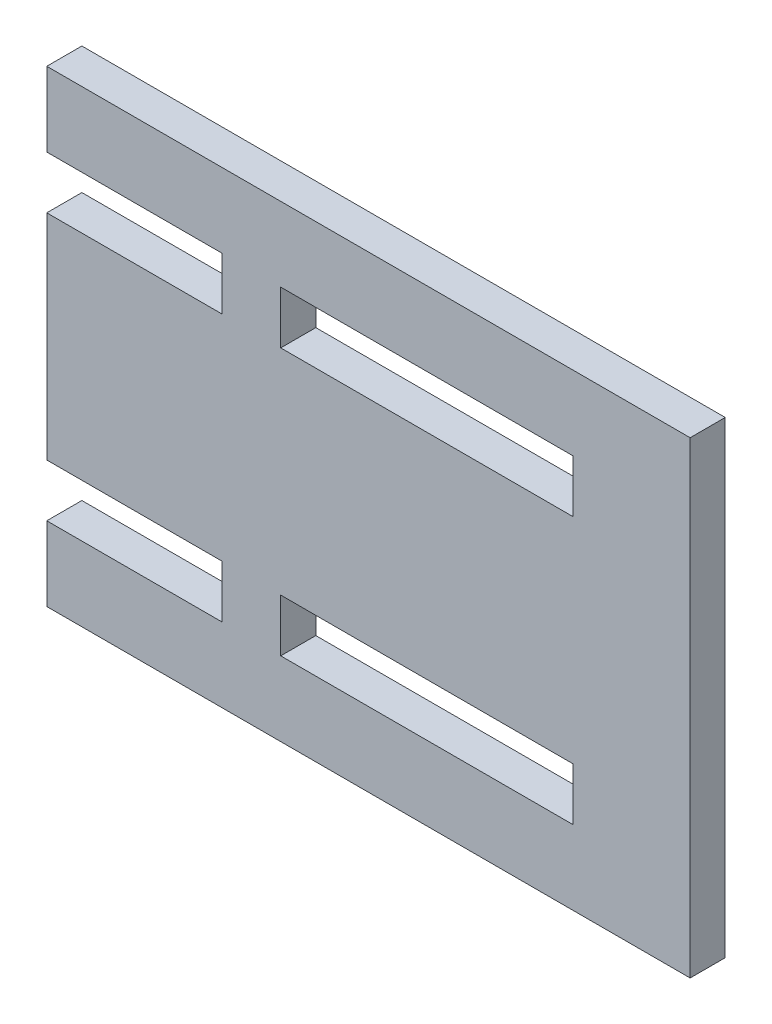
ISO-10303-21;
HEADER;
FILE_DESCRIPTION(('STEP AP214'),'2;1');
FILE_NAME('part.step','',(''),(''),'','','');
FILE_SCHEMA(('AUTOMOTIVE_DESIGN { 1 0 10303 214 1 1 1 1 }'));
ENDSEC;
DATA;
#1=APPLICATION_CONTEXT('core data for automotive mechanical design processes');
#2=APPLICATION_PROTOCOL_DEFINITION('international standard','automotive_design',2000,#1);
#3=PRODUCT_CONTEXT('',#1,'mechanical');
#4=PRODUCT('Part','Part','',(#3));
#5=PRODUCT_RELATED_PRODUCT_CATEGORY('part','',(#4));
#6=PRODUCT_DEFINITION_FORMATION('','',#4);
#7=PRODUCT_DEFINITION_CONTEXT('part definition',#1,'design');
#8=PRODUCT_DEFINITION('design','',#6,#7);
#9=PRODUCT_DEFINITION_SHAPE('','',#8);
#10=(LENGTH_UNIT() NAMED_UNIT(*) SI_UNIT(.MILLI.,.METRE.));
#11=(NAMED_UNIT(*) PLANE_ANGLE_UNIT() SI_UNIT($,.RADIAN.));
#12=(NAMED_UNIT(*) SI_UNIT($,.STERADIAN.) SOLID_ANGLE_UNIT());
#13=UNCERTAINTY_MEASURE_WITH_UNIT(LENGTH_MEASURE(1.E-05),#10,'distance_accuracy_value','');
#14=(GEOMETRIC_REPRESENTATION_CONTEXT(3) GLOBAL_UNCERTAINTY_ASSIGNED_CONTEXT((#13)) GLOBAL_UNIT_ASSIGNED_CONTEXT((#10,
#11,#12)) REPRESENTATION_CONTEXT('',''));
#15=CARTESIAN_POINT('',(0.,0.,0.));
#16=DIRECTION('',(0.,0.,1.));
#17=DIRECTION('',(1.,0.,0.));
#18=AXIS2_PLACEMENT_3D('',#15,#16,#17);
#19=CARTESIAN_POINT('',(-13.65,0.,-3.));
#20=DIRECTION('',(-1.,0.,0.));
#21=DIRECTION('',(0.,0.,1.));
#22=AXIS2_PLACEMENT_3D('',#19,#20,#21);
#23=PLANE('',#22);
#24=DIRECTION('',(0.,-1.,0.));
#25=VECTOR('',#24,1.);
#26=CARTESIAN_POINT('',(-13.65,0.,0.));
#27=LINE('',#26,#25);
#28=CARTESIAN_POINT('',(-13.65,0.,0.));
#29=VERTEX_POINT('',#28);
#30=CARTESIAN_POINT('',(-13.65,-4.5,0.));
#31=VERTEX_POINT('',#30);
#32=EDGE_CURVE('E251',#29,#31,#27,.T.);
#33=ORIENTED_EDGE('',*,*,#32,.T.);
#34=DIRECTION('',(0.,0.,1.));
#35=VECTOR('',#34,1.);
#36=CARTESIAN_POINT('',(-13.65,-4.5,-3.));
#37=LINE('',#36,#35);
#38=CARTESIAN_POINT('',(-13.65,-4.5,-3.));
#39=VERTEX_POINT('',#38);
#40=EDGE_CURVE('E11',#39,#31,#37,.T.);
#41=ORIENTED_EDGE('',*,*,#40,.F.);
#42=DIRECTION('',(0.,-1.,0.));
#43=VECTOR('',#42,1.);
#44=CARTESIAN_POINT('',(-13.65,0.,-3.));
#45=LINE('',#44,#43);
#46=CARTESIAN_POINT('',(-13.65,0.,-3.));
#47=VERTEX_POINT('',#46);
#48=EDGE_CURVE('E60',#47,#39,#45,.T.);
#49=ORIENTED_EDGE('',*,*,#48,.F.);
#50=DIRECTION('',(0.,0.,1.));
#51=VECTOR('',#50,1.);
#52=CARTESIAN_POINT('',(-13.65,0.,-3.));
#53=LINE('',#52,#51);
#54=EDGE_CURVE('E198',#47,#29,#53,.T.);
#55=ORIENTED_EDGE('',*,*,#54,.T.);
#56=EDGE_LOOP('',(#33,#41,#49,#55));
#57=FACE_BOUND('',#56,.T.);
#58=ADVANCED_FACE('F41',(#57),#23,.F.);
#59=CARTESIAN_POINT('',(0.,-4.5,-3.));
#60=DIRECTION('',(0.,1.,0.));
#61=DIRECTION('',(0.,0.,1.));
#62=AXIS2_PLACEMENT_3D('',#59,#60,#61);
#63=PLANE('',#62);
#64=DIRECTION('',(-1.,0.,0.));
#65=VECTOR('',#64,1.);
#66=CARTESIAN_POINT('',(0.,-4.5,0.));
#67=LINE('',#66,#65);
#68=CARTESIAN_POINT('',(11.35,-4.5,0.));
#69=VERTEX_POINT('',#68);
#70=EDGE_CURVE('E256',#69,#31,#67,.T.);
#71=ORIENTED_EDGE('',*,*,#70,.F.);
#72=DIRECTION('',(0.,0.,1.));
#73=VECTOR('',#72,1.);
#74=CARTESIAN_POINT('',(11.35,-4.5,-3.));
#75=LINE('',#74,#73);
#76=CARTESIAN_POINT('',(11.35,-4.5,-3.));
#77=VERTEX_POINT('',#76);
#78=EDGE_CURVE('E51',#77,#69,#75,.T.);
#79=ORIENTED_EDGE('',*,*,#78,.F.);
#80=DIRECTION('',(-1.,0.,0.));
#81=VECTOR('',#80,1.);
#82=CARTESIAN_POINT('',(0.,-4.5,-3.));
#83=LINE('',#82,#81);
#84=EDGE_CURVE('E190',#77,#39,#83,.T.);
#85=ORIENTED_EDGE('',*,*,#84,.T.);
#86=ORIENTED_EDGE('',*,*,#40,.T.);
#87=EDGE_LOOP('',(#71,#79,#85,#86));
#88=FACE_BOUND('',#87,.T.);
#89=ADVANCED_FACE('F315',(#88),#63,.T.);
#90=CARTESIAN_POINT('',(11.35,0.,-3.));
#91=DIRECTION('',(1.,0.,0.));
#92=DIRECTION('',(0.,0.,-1.));
#93=AXIS2_PLACEMENT_3D('',#90,#91,#92);
#94=PLANE('',#93);
#95=DIRECTION('',(0.,1.,0.));
#96=VECTOR('',#95,1.);
#97=CARTESIAN_POINT('',(11.35,0.,0.));
#98=LINE('',#97,#96);
#99=CARTESIAN_POINT('',(11.35,0.,0.));
#100=VERTEX_POINT('',#99);
#101=EDGE_CURVE('E195',#69,#100,#98,.T.);
#102=ORIENTED_EDGE('',*,*,#101,.T.);
#103=DIRECTION('',(0.,0.,1.));
#104=VECTOR('',#103,1.);
#105=CARTESIAN_POINT('',(11.35,0.,-3.));
#106=LINE('',#105,#104);
#107=CARTESIAN_POINT('',(11.35,0.,-3.));
#108=VERTEX_POINT('',#107);
#109=EDGE_CURVE('E193',#108,#100,#106,.T.);
#110=ORIENTED_EDGE('',*,*,#109,.F.);
#111=DIRECTION('',(0.,1.,0.));
#112=VECTOR('',#111,1.);
#113=CARTESIAN_POINT('',(11.35,0.,-3.));
#114=LINE('',#113,#112);
#115=EDGE_CURVE('E184',#77,#108,#114,.T.);
#116=ORIENTED_EDGE('',*,*,#115,.F.);
#117=ORIENTED_EDGE('',*,*,#78,.T.);
#118=EDGE_LOOP('',(#102,#110,#116,#117));
#119=FACE_BOUND('',#118,.T.);
#120=ADVANCED_FACE('F194',(#119),#94,.F.);
#121=CARTESIAN_POINT('',(0.,0.,-3.));
#122=DIRECTION('',(0.,1.,0.));
#123=DIRECTION('',(-1.,0.,0.));
#124=AXIS2_PLACEMENT_3D('',#121,#122,#123);
#125=PLANE('',#124);
#126=DIRECTION('',(-1.,0.,0.));
#127=VECTOR('',#126,1.);
#128=CARTESIAN_POINT('',(0.,0.,0.));
#129=LINE('',#128,#127);
#130=CARTESIAN_POINT('',(-18.65,0.,0.));
#131=VERTEX_POINT('',#130);
#132=CARTESIAN_POINT('',(-33.65,0.,0.));
#133=VERTEX_POINT('',#132);
#134=EDGE_CURVE('E220',#131,#133,#129,.T.);
#135=ORIENTED_EDGE('',*,*,#134,.T.);
#136=DIRECTION('',(0.,0.,1.));
#137=VECTOR('',#136,1.);
#138=CARTESIAN_POINT('',(-33.65,0.,-3.));
#139=LINE('',#138,#137);
#140=CARTESIAN_POINT('',(-33.65,0.,-3.));
#141=VERTEX_POINT('',#140);
#142=EDGE_CURVE('E262',#141,#133,#139,.T.);
#143=ORIENTED_EDGE('',*,*,#142,.F.);
#144=DIRECTION('',(-1.,0.,0.));
#145=VECTOR('',#144,1.);
#146=CARTESIAN_POINT('',(0.,0.,-3.));
#147=LINE('',#146,#145);
#148=CARTESIAN_POINT('',(-18.65,0.,-3.));
#149=VERTEX_POINT('',#148);
#150=EDGE_CURVE('E374',#149,#141,#147,.T.);
#151=ORIENTED_EDGE('',*,*,#150,.F.);
#152=DIRECTION('',(0.,0.,1.));
#153=VECTOR('',#152,1.);
#154=CARTESIAN_POINT('',(-18.65,0.,-3.));
#155=LINE('',#154,#153);
#156=EDGE_CURVE('E286',#149,#131,#155,.T.);
#157=ORIENTED_EDGE('',*,*,#156,.T.);
#158=EDGE_LOOP('',(#135,#143,#151,#157));
#159=FACE_BOUND('',#158,.T.);
#160=ADVANCED_FACE('F328',(#159),#125,.F.);
#161=CARTESIAN_POINT('',(-33.65,0.,-3.));
#162=DIRECTION('',(1.,0.,0.));
#163=DIRECTION('',(0.,0.,-1.));
#164=AXIS2_PLACEMENT_3D('',#161,#162,#163);
#165=PLANE('',#164);
#166=DIRECTION('',(0.,1.,0.));
#167=VECTOR('',#166,1.);
#168=CARTESIAN_POINT('',(-33.65,0.,0.));
#169=LINE('',#168,#167);
#170=CARTESIAN_POINT('',(-33.65,18.3000000000002,0.));
#171=VERTEX_POINT('',#170);
#172=EDGE_CURVE('E233',#133,#171,#169,.T.);
#173=ORIENTED_EDGE('',*,*,#172,.T.);
#174=DIRECTION('',(0.,0.,1.));
#175=VECTOR('',#174,1.);
#176=CARTESIAN_POINT('',(-33.65,18.3000000000002,-3.));
#177=LINE('',#176,#175);
#178=CARTESIAN_POINT('',(-33.65,18.3000000000002,-3.));
#179=VERTEX_POINT('',#178);
#180=EDGE_CURVE('E265',#179,#171,#177,.T.);
#181=ORIENTED_EDGE('',*,*,#180,.F.);
#182=DIRECTION('',(0.,1.,0.));
#183=VECTOR('',#182,1.);
#184=CARTESIAN_POINT('',(-33.65,0.,-3.));
#185=LINE('',#184,#183);
#186=EDGE_CURVE('E203',#141,#179,#185,.T.);
#187=ORIENTED_EDGE('',*,*,#186,.F.);
#188=ORIENTED_EDGE('',*,*,#142,.T.);
#189=EDGE_LOOP('',(#173,#181,#187,#188));
#190=FACE_BOUND('',#189,.T.);
#191=ADVANCED_FACE('F324',(#190),#165,.F.);
#192=CARTESIAN_POINT('',(0.,18.3000000000002,-3.));
#193=DIRECTION('',(0.,1.,0.));
#194=DIRECTION('',(-1.,0.,0.));
#195=AXIS2_PLACEMENT_3D('',#192,#193,#194);
#196=PLANE('',#195);
#197=DIRECTION('',(-1.,0.,0.));
#198=VECTOR('',#197,1.);
#199=CARTESIAN_POINT('',(0.,18.3000000000002,0.));
#200=LINE('',#199,#198);
#201=CARTESIAN_POINT('',(-18.65,18.3000000000002,0.));
#202=VERTEX_POINT('',#201);
#203=EDGE_CURVE('E248',#202,#171,#200,.T.);
#204=ORIENTED_EDGE('',*,*,#203,.F.);
#205=DIRECTION('',(0.,0.,1.));
#206=VECTOR('',#205,1.);
#207=CARTESIAN_POINT('',(-18.65,18.3000000000002,-3.));
#208=LINE('',#207,#206);
#209=CARTESIAN_POINT('',(-18.65,18.3000000000002,-3.));
#210=VERTEX_POINT('',#209);
#211=EDGE_CURVE('E267',#210,#202,#208,.T.);
#212=ORIENTED_EDGE('',*,*,#211,.F.);
#213=DIRECTION('',(-1.,0.,0.));
#214=VECTOR('',#213,1.);
#215=CARTESIAN_POINT('',(0.,18.3000000000002,-3.));
#216=LINE('',#215,#214);
#217=EDGE_CURVE('E405',#210,#179,#216,.T.);
#218=ORIENTED_EDGE('',*,*,#217,.T.);
#219=ORIENTED_EDGE('',*,*,#180,.T.);
#220=EDGE_LOOP('',(#204,#212,#218,#219));
#221=FACE_BOUND('',#220,.T.);
#222=ADVANCED_FACE('F327',(#221),#196,.T.);
#223=CARTESIAN_POINT('',(-18.65,0.,-3.));
#224=DIRECTION('',(-1.,0.,0.));
#225=DIRECTION('',(0.,0.,1.));
#226=AXIS2_PLACEMENT_3D('',#223,#224,#225);
#227=PLANE('',#226);
#228=DIRECTION('',(0.,-1.,0.));
#229=VECTOR('',#228,1.);
#230=CARTESIAN_POINT('',(-18.65,0.,0.));
#231=LINE('',#230,#229);
#232=CARTESIAN_POINT('',(-18.65,22.8000000000002,0.));
#233=VERTEX_POINT('',#232);
#234=EDGE_CURVE('E245',#233,#202,#231,.T.);
#235=ORIENTED_EDGE('',*,*,#234,.F.);
#236=DIRECTION('',(0.,0.,1.));
#237=VECTOR('',#236,1.);
#238=CARTESIAN_POINT('',(-18.65,22.8000000000002,-3.));
#239=LINE('',#238,#237);
#240=CARTESIAN_POINT('',(-18.65,22.8000000000002,-3.));
#241=VERTEX_POINT('',#240);
#242=EDGE_CURVE('E269',#241,#233,#239,.T.);
#243=ORIENTED_EDGE('',*,*,#242,.F.);
#244=DIRECTION('',(0.,-1.,0.));
#245=VECTOR('',#244,1.);
#246=CARTESIAN_POINT('',(-18.65,0.,-3.));
#247=LINE('',#246,#245);
#248=EDGE_CURVE('E403',#241,#210,#247,.T.);
#249=ORIENTED_EDGE('',*,*,#248,.T.);
#250=ORIENTED_EDGE('',*,*,#211,.T.);
#251=EDGE_LOOP('',(#235,#243,#249,#250));
#252=FACE_BOUND('',#251,.T.);
#253=ADVANCED_FACE('F334',(#252),#227,.T.);
#254=CARTESIAN_POINT('',(-3.11140002651206E-13,22.8000000000004,-3.));
#255=DIRECTION('',(0.,-1.,0.));
#256=DIRECTION('',(1.,0.,0.));
#257=AXIS2_PLACEMENT_3D('',#254,#255,#256);
#258=PLANE('',#257);
#259=DIRECTION('',(1.,0.,0.));
#260=VECTOR('',#259,1.);
#261=CARTESIAN_POINT('',(-3.11140002651206E-13,22.8000000000004,0.));
#262=LINE('',#261,#260);
#263=CARTESIAN_POINT('',(-33.65,22.8000000000001,0.));
#264=VERTEX_POINT('',#263);
#265=EDGE_CURVE('E242',#264,#233,#262,.T.);
#266=ORIENTED_EDGE('',*,*,#265,.F.);
#267=DIRECTION('',(0.,0.,1.));
#268=VECTOR('',#267,1.);
#269=CARTESIAN_POINT('',(-33.65,22.8000000000001,-3.));
#270=LINE('',#269,#268);
#271=CARTESIAN_POINT('',(-33.65,22.8000000000001,-3.));
#272=VERTEX_POINT('',#271);
#273=EDGE_CURVE('E271',#272,#264,#270,.T.);
#274=ORIENTED_EDGE('',*,*,#273,.F.);
#275=DIRECTION('',(1.,0.,0.));
#276=VECTOR('',#275,1.);
#277=CARTESIAN_POINT('',(-3.11140002651206E-13,22.8000000000004,-3.));
#278=LINE('',#277,#276);
#279=EDGE_CURVE('E400',#272,#241,#278,.T.);
#280=ORIENTED_EDGE('',*,*,#279,.T.);
#281=ORIENTED_EDGE('',*,*,#242,.T.);
#282=EDGE_LOOP('',(#266,#274,#280,#281));
#283=FACE_BOUND('',#282,.T.);
#284=ADVANCED_FACE('F338',(#283),#258,.T.);
#285=CARTESIAN_POINT('',(-33.65,29.1500000000001,0.));
#286=VERTEX_POINT('',#285);
#287=EDGE_CURVE('E234',#264,#286,#169,.T.);
#288=ORIENTED_EDGE('',*,*,#287,.T.);
#289=DIRECTION('',(0.,0.,1.));
#290=VECTOR('',#289,1.);
#291=CARTESIAN_POINT('',(-33.65,29.1500000000001,-3.));
#292=LINE('',#291,#290);
#293=CARTESIAN_POINT('',(-33.65,29.1500000000001,-3.));
#294=VERTEX_POINT('',#293);
#295=EDGE_CURVE('E273',#294,#286,#292,.T.);
#296=ORIENTED_EDGE('',*,*,#295,.F.);
#297=EDGE_CURVE('E392',#272,#294,#185,.T.);
#298=ORIENTED_EDGE('',*,*,#297,.F.);
#299=ORIENTED_EDGE('',*,*,#273,.T.);
#300=EDGE_LOOP('',(#288,#296,#298,#299));
#301=FACE_BOUND('',#300,.T.);
#302=ADVANCED_FACE('F331',(#301),#165,.F.);
#303=CARTESIAN_POINT('',(0.,29.1500000000001,-3.));
#304=DIRECTION('',(0.,1.,0.));
#305=DIRECTION('',(-1.,0.,0.));
#306=AXIS2_PLACEMENT_3D('',#303,#304,#305);
#307=PLANE('',#306);
#308=DIRECTION('',(-1.,0.,0.));
#309=VECTOR('',#308,1.);
#310=CARTESIAN_POINT('',(0.,29.1500000000001,0.));
#311=LINE('',#310,#309);
#312=CARTESIAN_POINT('',(21.35,29.1500000000001,0.));
#313=VERTEX_POINT('',#312);
#314=EDGE_CURVE('E239',#313,#286,#311,.T.);
#315=ORIENTED_EDGE('',*,*,#314,.F.);
#316=DIRECTION('',(0.,0.,1.));
#317=VECTOR('',#316,1.);
#318=CARTESIAN_POINT('',(21.35,29.1500000000001,-3.));
#319=LINE('',#318,#317);
#320=CARTESIAN_POINT('',(21.35,29.1500000000001,-3.));
#321=VERTEX_POINT('',#320);
#322=EDGE_CURVE('E275',#321,#313,#319,.T.);
#323=ORIENTED_EDGE('',*,*,#322,.F.);
#324=DIRECTION('',(-1.,0.,0.));
#325=VECTOR('',#324,1.);
#326=CARTESIAN_POINT('',(0.,29.1500000000001,-3.));
#327=LINE('',#326,#325);
#328=EDGE_CURVE('E397',#321,#294,#327,.T.);
#329=ORIENTED_EDGE('',*,*,#328,.T.);
#330=ORIENTED_EDGE('',*,*,#295,.T.);
#331=EDGE_LOOP('',(#315,#323,#329,#330));
#332=FACE_BOUND('',#331,.T.);
#333=ADVANCED_FACE('F343',(#332),#307,.T.);
#334=CARTESIAN_POINT('',(21.35,0.,-3.));
#335=DIRECTION('',(1.,0.,0.));
#336=DIRECTION('',(0.,0.,-1.));
#337=AXIS2_PLACEMENT_3D('',#334,#335,#336);
#338=PLANE('',#337);
#339=DIRECTION('',(0.,1.,0.));
#340=VECTOR('',#339,1.);
#341=CARTESIAN_POINT('',(21.35,0.,0.));
#342=LINE('',#341,#340);
#343=CARTESIAN_POINT('',(21.35,-10.8499999999999,0.));
#344=VERTEX_POINT('',#343);
#345=EDGE_CURVE('E236',#344,#313,#342,.T.);
#346=ORIENTED_EDGE('',*,*,#345,.F.);
#347=DIRECTION('',(0.,0.,1.));
#348=VECTOR('',#347,1.);
#349=CARTESIAN_POINT('',(21.35,-10.8499999999999,-3.));
#350=LINE('',#349,#348);
#351=CARTESIAN_POINT('',(21.35,-10.8499999999999,-3.));
#352=VERTEX_POINT('',#351);
#353=EDGE_CURVE('E277',#352,#344,#350,.T.);
#354=ORIENTED_EDGE('',*,*,#353,.F.);
#355=DIRECTION('',(0.,1.,0.));
#356=VECTOR('',#355,1.);
#357=CARTESIAN_POINT('',(21.35,0.,-3.));
#358=LINE('',#357,#356);
#359=EDGE_CURVE('E394',#352,#321,#358,.T.);
#360=ORIENTED_EDGE('',*,*,#359,.T.);
#361=ORIENTED_EDGE('',*,*,#322,.T.);
#362=EDGE_LOOP('',(#346,#354,#360,#361));
#363=FACE_BOUND('',#362,.T.);
#364=ADVANCED_FACE('F346',(#363),#338,.T.);
#365=CARTESIAN_POINT('',(0.,-10.8499999999999,-3.));
#366=DIRECTION('',(0.,1.,0.));
#367=DIRECTION('',(-1.,0.,0.));
#368=AXIS2_PLACEMENT_3D('',#365,#366,#367);
#369=PLANE('',#368);
#370=DIRECTION('',(-1.,0.,0.));
#371=VECTOR('',#370,1.);
#372=CARTESIAN_POINT('',(0.,-10.8499999999999,0.));
#373=LINE('',#372,#371);
#374=CARTESIAN_POINT('',(-33.65,-10.8499999999999,0.));
#375=VERTEX_POINT('',#374);
#376=EDGE_CURVE('E232',#344,#375,#373,.T.);
#377=ORIENTED_EDGE('',*,*,#376,.T.);
#378=DIRECTION('',(0.,0.,1.));
#379=VECTOR('',#378,1.);
#380=CARTESIAN_POINT('',(-33.65,-10.8499999999999,-3.));
#381=LINE('',#380,#379);
#382=CARTESIAN_POINT('',(-33.65,-10.8499999999999,-3.));
#383=VERTEX_POINT('',#382);
#384=EDGE_CURVE('E279',#383,#375,#381,.T.);
#385=ORIENTED_EDGE('',*,*,#384,.F.);
#386=DIRECTION('',(-1.,0.,0.));
#387=VECTOR('',#386,1.);
#388=CARTESIAN_POINT('',(0.,-10.8499999999999,-3.));
#389=LINE('',#388,#387);
#390=EDGE_CURVE('E391',#352,#383,#389,.T.);
#391=ORIENTED_EDGE('',*,*,#390,.F.);
#392=ORIENTED_EDGE('',*,*,#353,.T.);
#393=EDGE_LOOP('',(#377,#385,#391,#392));
#394=FACE_BOUND('',#393,.T.);
#395=ADVANCED_FACE('F350',(#394),#369,.F.);
#396=CARTESIAN_POINT('',(-33.65,-4.5,0.));
#397=VERTEX_POINT('',#396);
#398=EDGE_CURVE('E229',#375,#397,#169,.T.);
#399=ORIENTED_EDGE('',*,*,#398,.T.);
#400=DIRECTION('',(0.,0.,1.));
#401=VECTOR('',#400,1.);
#402=CARTESIAN_POINT('',(-33.65,-4.5,-3.));
#403=LINE('',#402,#401);
#404=CARTESIAN_POINT('',(-33.65,-4.5,-3.));
#405=VERTEX_POINT('',#404);
#406=EDGE_CURVE('E282',#405,#397,#403,.T.);
#407=ORIENTED_EDGE('',*,*,#406,.F.);
#408=EDGE_CURVE('E389',#383,#405,#185,.T.);
#409=ORIENTED_EDGE('',*,*,#408,.F.);
#410=ORIENTED_EDGE('',*,*,#384,.T.);
#411=EDGE_LOOP('',(#399,#407,#409,#410));
#412=FACE_BOUND('',#411,.T.);
#413=ADVANCED_FACE('F330',(#412),#165,.F.);
#414=CARTESIAN_POINT('',(0.,-4.5,-3.));
#415=DIRECTION('',(0.,1.,0.));
#416=DIRECTION('',(-1.,0.,0.));
#417=AXIS2_PLACEMENT_3D('',#414,#415,#416);
#418=PLANE('',#417);
#419=DIRECTION('',(-1.,0.,0.));
#420=VECTOR('',#419,1.);
#421=CARTESIAN_POINT('',(0.,-4.5,0.));
#422=LINE('',#421,#420);
#423=CARTESIAN_POINT('',(-18.65,-4.5,0.));
#424=VERTEX_POINT('',#423);
#425=EDGE_CURVE('E226',#424,#397,#422,.T.);
#426=ORIENTED_EDGE('',*,*,#425,.F.);
#427=DIRECTION('',(0.,0.,1.));
#428=VECTOR('',#427,1.);
#429=CARTESIAN_POINT('',(-18.65,-4.5,-3.));
#430=LINE('',#429,#428);
#431=CARTESIAN_POINT('',(-18.65,-4.5,-3.));
#432=VERTEX_POINT('',#431);
#433=EDGE_CURVE('E284',#432,#424,#430,.T.);
#434=ORIENTED_EDGE('',*,*,#433,.F.);
#435=DIRECTION('',(-1.,0.,0.));
#436=VECTOR('',#435,1.);
#437=CARTESIAN_POINT('',(0.,-4.5,-3.));
#438=LINE('',#437,#436);
#439=EDGE_CURVE('E386',#432,#405,#438,.T.);
#440=ORIENTED_EDGE('',*,*,#439,.T.);
#441=ORIENTED_EDGE('',*,*,#406,.T.);
#442=EDGE_LOOP('',(#426,#434,#440,#441));
#443=FACE_BOUND('',#442,.T.);
#444=ADVANCED_FACE('F355',(#443),#418,.T.);
#445=CARTESIAN_POINT('',(11.35,0.,-3.));
#446=DIRECTION('',(1.,0.,0.));
#447=DIRECTION('',(0.,0.,-1.));
#448=AXIS2_PLACEMENT_3D('',#445,#446,#447);
#449=PLANE('',#448);
#450=DIRECTION('',(0.,1.,0.));
#451=VECTOR('',#450,1.);
#452=CARTESIAN_POINT('',(11.35,0.,0.));
#453=LINE('',#452,#451);
#454=CARTESIAN_POINT('',(11.35,18.3000000000002,0.));
#455=VERTEX_POINT('',#454);
#456=CARTESIAN_POINT('',(11.35,22.8000000000002,0.));
#457=VERTEX_POINT('',#456);
#458=EDGE_CURVE('E208',#455,#457,#453,.T.);
#459=ORIENTED_EDGE('',*,*,#458,.T.);
#460=DIRECTION('',(0.,0.,1.));
#461=VECTOR('',#460,1.);
#462=CARTESIAN_POINT('',(11.35,22.8000000000002,-3.));
#463=LINE('',#462,#461);
#464=CARTESIAN_POINT('',(11.35,22.8000000000002,-3.));
#465=VERTEX_POINT('',#464);
#466=EDGE_CURVE('E288',#465,#457,#463,.T.);
#467=ORIENTED_EDGE('',*,*,#466,.F.);
#468=DIRECTION('',(0.,1.,0.));
#469=VECTOR('',#468,1.);
#470=CARTESIAN_POINT('',(11.35,0.,-3.));
#471=LINE('',#470,#469);
#472=CARTESIAN_POINT('',(11.35,18.3000000000002,-3.));
#473=VERTEX_POINT('',#472);
#474=EDGE_CURVE('E258',#473,#465,#471,.T.);
#475=ORIENTED_EDGE('',*,*,#474,.F.);
#476=DIRECTION('',(0.,0.,1.));
#477=VECTOR('',#476,1.);
#478=CARTESIAN_POINT('',(11.35,18.3000000000002,-3.));
#479=LINE('',#478,#477);
#480=EDGE_CURVE('E45',#473,#455,#479,.T.);
#481=ORIENTED_EDGE('',*,*,#480,.T.);
#482=EDGE_LOOP('',(#459,#467,#475,#481));
#483=FACE_BOUND('',#482,.T.);
#484=ADVANCED_FACE('F43',(#483),#449,.F.);
#485=CARTESIAN_POINT('',(0.,22.8000000000002,-3.));
#486=DIRECTION('',(0.,-1.,0.));
#487=DIRECTION('',(0.,0.,-1.));
#488=AXIS2_PLACEMENT_3D('',#485,#486,#487);
#489=PLANE('',#488);
#490=DIRECTION('',(1.,0.,0.));
#491=VECTOR('',#490,1.);
#492=CARTESIAN_POINT('',(0.,22.8000000000002,0.));
#493=LINE('',#492,#491);
#494=CARTESIAN_POINT('',(-13.65,22.8000000000002,0.));
#495=VERTEX_POINT('',#494);
#496=EDGE_CURVE('E217',#495,#457,#493,.T.);
#497=ORIENTED_EDGE('',*,*,#496,.F.);
#498=DIRECTION('',(0.,0.,1.));
#499=VECTOR('',#498,1.);
#500=CARTESIAN_POINT('',(-13.65,22.8000000000002,-3.));
#501=LINE('',#500,#499);
#502=CARTESIAN_POINT('',(-13.65,22.8000000000002,-3.));
#503=VERTEX_POINT('',#502);
#504=EDGE_CURVE('E290',#503,#495,#501,.T.);
#505=ORIENTED_EDGE('',*,*,#504,.F.);
#506=DIRECTION('',(1.,0.,0.));
#507=VECTOR('',#506,1.);
#508=CARTESIAN_POINT('',(0.,22.8000000000002,-3.));
#509=LINE('',#508,#507);
#510=EDGE_CURVE('E372',#503,#465,#509,.T.);
#511=ORIENTED_EDGE('',*,*,#510,.T.);
#512=ORIENTED_EDGE('',*,*,#466,.T.);
#513=EDGE_LOOP('',(#497,#505,#511,#512));
#514=FACE_BOUND('',#513,.T.);
#515=ADVANCED_FACE('F362',(#514),#489,.T.);
#516=CARTESIAN_POINT('',(-13.65,0.,-3.));
#517=DIRECTION('',(-1.,0.,0.));
#518=DIRECTION('',(0.,0.,1.));
#519=AXIS2_PLACEMENT_3D('',#516,#517,#518);
#520=PLANE('',#519);
#521=DIRECTION('',(0.,-1.,0.));
#522=VECTOR('',#521,1.);
#523=CARTESIAN_POINT('',(-13.65,0.,0.));
#524=LINE('',#523,#522);
#525=CARTESIAN_POINT('',(-13.65,18.3000000000002,0.));
#526=VERTEX_POINT('',#525);
#527=EDGE_CURVE('E214',#495,#526,#524,.T.);
#528=ORIENTED_EDGE('',*,*,#527,.T.);
#529=DIRECTION('',(0.,0.,1.));
#530=VECTOR('',#529,1.);
#531=CARTESIAN_POINT('',(-13.65,18.3000000000002,-3.));
#532=LINE('',#531,#530);
#533=CARTESIAN_POINT('',(-13.65,18.3000000000002,-3.));
#534=VERTEX_POINT('',#533);
#535=EDGE_CURVE('E291',#534,#526,#532,.T.);
#536=ORIENTED_EDGE('',*,*,#535,.F.);
#537=DIRECTION('',(0.,-1.,0.));
#538=VECTOR('',#537,1.);
#539=CARTESIAN_POINT('',(-13.65,0.,-3.));
#540=LINE('',#539,#538);
#541=EDGE_CURVE('E375',#503,#534,#540,.T.);
#542=ORIENTED_EDGE('',*,*,#541,.F.);
#543=ORIENTED_EDGE('',*,*,#504,.T.);
#544=EDGE_LOOP('',(#528,#536,#542,#543));
#545=FACE_BOUND('',#544,.T.);
#546=ADVANCED_FACE('F310',(#545),#520,.F.);
#547=CARTESIAN_POINT('',(-18.65,0.,-3.));
#548=DIRECTION('',(-1.,0.,0.));
#549=DIRECTION('',(0.,0.,1.));
#550=AXIS2_PLACEMENT_3D('',#547,#548,#549);
#551=PLANE('',#550);
#552=DIRECTION('',(0.,-1.,0.));
#553=VECTOR('',#552,1.);
#554=CARTESIAN_POINT('',(-18.65,0.,0.));
#555=LINE('',#554,#553);
#556=EDGE_CURVE('E223',#131,#424,#555,.T.);
#557=ORIENTED_EDGE('',*,*,#556,.F.);
#558=ORIENTED_EDGE('',*,*,#156,.F.);
#559=DIRECTION('',(0.,-1.,0.));
#560=VECTOR('',#559,1.);
#561=CARTESIAN_POINT('',(-18.65,0.,-3.));
#562=LINE('',#561,#560);
#563=EDGE_CURVE('E378',#149,#432,#562,.T.);
#564=ORIENTED_EDGE('',*,*,#563,.T.);
#565=ORIENTED_EDGE('',*,*,#433,.T.);
#566=EDGE_LOOP('',(#557,#558,#564,#565));
#567=FACE_BOUND('',#566,.T.);
#568=ADVANCED_FACE('F304',(#567),#551,.T.);
#569=CARTESIAN_POINT('',(0.,18.3000000000002,-3.));
#570=DIRECTION('',(0.,1.,0.));
#571=DIRECTION('',(0.,0.,1.));
#572=AXIS2_PLACEMENT_3D('',#569,#570,#571);
#573=PLANE('',#572);
#574=DIRECTION('',(-1.,0.,0.));
#575=VECTOR('',#574,1.);
#576=CARTESIAN_POINT('',(0.,18.3000000000002,0.));
#577=LINE('',#576,#575);
#578=EDGE_CURVE('E211',#455,#526,#577,.T.);
#579=ORIENTED_EDGE('',*,*,#578,.F.);
#580=ORIENTED_EDGE('',*,*,#480,.F.);
#581=DIRECTION('',(-1.,0.,0.));
#582=VECTOR('',#581,1.);
#583=CARTESIAN_POINT('',(0.,18.3000000000002,-3.));
#584=LINE('',#583,#582);
#585=EDGE_CURVE('E380',#473,#534,#584,.T.);
#586=ORIENTED_EDGE('',*,*,#585,.T.);
#587=ORIENTED_EDGE('',*,*,#535,.T.);
#588=EDGE_LOOP('',(#579,#580,#586,#587));
#589=FACE_BOUND('',#588,.T.);
#590=ADVANCED_FACE('F302',(#589),#573,.T.);
#591=CARTESIAN_POINT('',(0.,0.,-3.));
#592=DIRECTION('',(0.,1.,0.));
#593=DIRECTION('',(0.,0.,1.));
#594=AXIS2_PLACEMENT_3D('',#591,#592,#593);
#595=PLANE('',#594);
#596=DIRECTION('',(-1.,0.,0.));
#597=VECTOR('',#596,1.);
#598=CARTESIAN_POINT('',(0.,0.,0.));
#599=LINE('',#598,#597);
#600=EDGE_CURVE('E253',#100,#29,#599,.T.);
#601=ORIENTED_EDGE('',*,*,#600,.T.);
#602=ORIENTED_EDGE('',*,*,#54,.F.);
#603=DIRECTION('',(-1.,0.,0.));
#604=VECTOR('',#603,1.);
#605=CARTESIAN_POINT('',(0.,0.,-3.));
#606=LINE('',#605,#604);
#607=EDGE_CURVE('E188',#108,#47,#606,.T.);
#608=ORIENTED_EDGE('',*,*,#607,.F.);
#609=ORIENTED_EDGE('',*,*,#109,.T.);
#610=EDGE_LOOP('',(#601,#602,#608,#609));
#611=FACE_BOUND('',#610,.T.);
#612=ADVANCED_FACE('F200',(#611),#595,.F.);
#613=CARTESIAN_POINT('',(0.,0.,-3.));
#614=DIRECTION('',(0.,0.,1.));
#615=DIRECTION('',(1.,0.,0.));
#616=AXIS2_PLACEMENT_3D('',#613,#614,#615);
#617=PLANE('',#616);
#618=ORIENTED_EDGE('',*,*,#474,.T.);
#619=ORIENTED_EDGE('',*,*,#510,.F.);
#620=ORIENTED_EDGE('',*,*,#541,.T.);
#621=ORIENTED_EDGE('',*,*,#585,.F.);
#622=EDGE_LOOP('',(#618,#619,#620,#621));
#623=FACE_BOUND('',#622,.T.);
#624=ORIENTED_EDGE('',*,*,#150,.T.);
#625=ORIENTED_EDGE('',*,*,#186,.T.);
#626=ORIENTED_EDGE('',*,*,#217,.F.);
#627=ORIENTED_EDGE('',*,*,#248,.F.);
#628=ORIENTED_EDGE('',*,*,#279,.F.);
#629=ORIENTED_EDGE('',*,*,#297,.T.);
#630=ORIENTED_EDGE('',*,*,#328,.F.);
#631=ORIENTED_EDGE('',*,*,#359,.F.);
#632=ORIENTED_EDGE('',*,*,#390,.T.);
#633=ORIENTED_EDGE('',*,*,#408,.T.);
#634=ORIENTED_EDGE('',*,*,#439,.F.);
#635=ORIENTED_EDGE('',*,*,#563,.F.);
#636=EDGE_LOOP('',(#624,#625,#626,#627,#628,#629,#630,#631,#632,#633,#634,#635));
#637=FACE_BOUND('',#636,.T.);
#638=ORIENTED_EDGE('',*,*,#48,.T.);
#639=ORIENTED_EDGE('',*,*,#84,.F.);
#640=ORIENTED_EDGE('',*,*,#115,.T.);
#641=ORIENTED_EDGE('',*,*,#607,.T.);
#642=EDGE_LOOP('',(#638,#639,#640,#641));
#643=FACE_BOUND('',#642,.T.);
#644=ADVANCED_FACE('F186',(#623,#637,#643),#617,.F.);
#645=CARTESIAN_POINT('',(0.,0.,0.));
#646=DIRECTION('',(0.,0.,1.));
#647=DIRECTION('',(1.,0.,0.));
#648=AXIS2_PLACEMENT_3D('',#645,#646,#647);
#649=PLANE('',#648);
#650=ORIENTED_EDGE('',*,*,#458,.F.);
#651=ORIENTED_EDGE('',*,*,#578,.T.);
#652=ORIENTED_EDGE('',*,*,#527,.F.);
#653=ORIENTED_EDGE('',*,*,#496,.T.);
#654=EDGE_LOOP('',(#650,#651,#652,#653));
#655=FACE_BOUND('',#654,.T.);
#656=ORIENTED_EDGE('',*,*,#134,.F.);
#657=ORIENTED_EDGE('',*,*,#556,.T.);
#658=ORIENTED_EDGE('',*,*,#425,.T.);
#659=ORIENTED_EDGE('',*,*,#398,.F.);
#660=ORIENTED_EDGE('',*,*,#376,.F.);
#661=ORIENTED_EDGE('',*,*,#345,.T.);
#662=ORIENTED_EDGE('',*,*,#314,.T.);
#663=ORIENTED_EDGE('',*,*,#287,.F.);
#664=ORIENTED_EDGE('',*,*,#265,.T.);
#665=ORIENTED_EDGE('',*,*,#234,.T.);
#666=ORIENTED_EDGE('',*,*,#203,.T.);
#667=ORIENTED_EDGE('',*,*,#172,.F.);
#668=EDGE_LOOP('',(#656,#657,#658,#659,#660,#661,#662,#663,#664,#665,#666,#667));
#669=FACE_BOUND('',#668,.T.);
#670=ORIENTED_EDGE('',*,*,#32,.F.);
#671=ORIENTED_EDGE('',*,*,#600,.F.);
#672=ORIENTED_EDGE('',*,*,#101,.F.);
#673=ORIENTED_EDGE('',*,*,#70,.T.);
#674=EDGE_LOOP('',(#670,#671,#672,#673));
#675=FACE_BOUND('',#674,.T.);
#676=ADVANCED_FACE('F298',(#655,#669,#675),#649,.T.);
#677=CLOSED_SHELL('',(#58,#89,#120,#160,#191,#222,#253,#284,#302,#333,#364,#395,#413,#444,#484,
#515,#546,#568,#590,#612,#644,#676));
#678=MANIFOLD_SOLID_BREP('B2',#677);
#679=ADVANCED_BREP_SHAPE_REPRESENTATION('',(#18,#678),#14);
#680=SHAPE_DEFINITION_REPRESENTATION(#9,#679);
ENDSEC;
END-ISO-10303-21;
